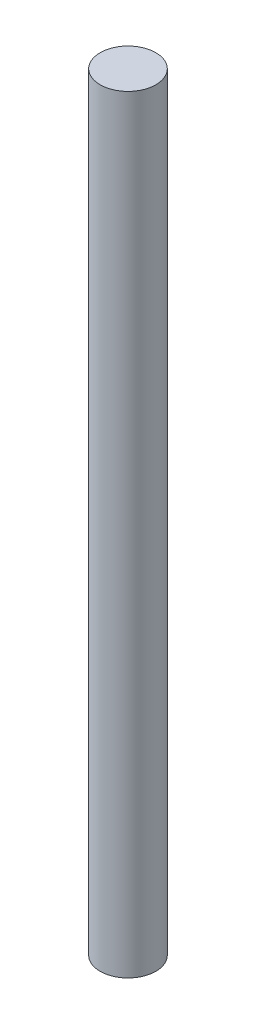
ISO-10303-21;
HEADER;
FILE_DESCRIPTION(('STEP AP214'),'2;1');
FILE_NAME('part.step','',(''),(''),'','','');
FILE_SCHEMA(('AUTOMOTIVE_DESIGN { 1 0 10303 214 1 1 1 1 }'));
ENDSEC;
DATA;
#1=APPLICATION_CONTEXT('core data for automotive mechanical design processes');
#2=APPLICATION_PROTOCOL_DEFINITION('international standard','automotive_design',2000,#1);
#3=PRODUCT_CONTEXT('',#1,'mechanical');
#4=PRODUCT('Part','Part','',(#3));
#5=PRODUCT_RELATED_PRODUCT_CATEGORY('part','',(#4));
#6=PRODUCT_DEFINITION_FORMATION('','',#4);
#7=PRODUCT_DEFINITION_CONTEXT('part definition',#1,'design');
#8=PRODUCT_DEFINITION('design','',#6,#7);
#9=PRODUCT_DEFINITION_SHAPE('','',#8);
#10=(LENGTH_UNIT() NAMED_UNIT(*) SI_UNIT(.MILLI.,.METRE.));
#11=(NAMED_UNIT(*) PLANE_ANGLE_UNIT() SI_UNIT($,.RADIAN.));
#12=(NAMED_UNIT(*) SI_UNIT($,.STERADIAN.) SOLID_ANGLE_UNIT());
#13=UNCERTAINTY_MEASURE_WITH_UNIT(LENGTH_MEASURE(1.E-05),#10,'distance_accuracy_value','');
#14=(GEOMETRIC_REPRESENTATION_CONTEXT(3) GLOBAL_UNCERTAINTY_ASSIGNED_CONTEXT((#13)) GLOBAL_UNIT_ASSIGNED_CONTEXT((#10,
#11,#12)) REPRESENTATION_CONTEXT('',''));
#15=CARTESIAN_POINT('',(0.,0.,0.));
#16=DIRECTION('',(0.,0.,1.));
#17=DIRECTION('',(1.,0.,0.));
#18=AXIS2_PLACEMENT_3D('',#15,#16,#17);
#19=CARTESIAN_POINT('',(0.,138.,0.));
#20=DIRECTION('',(0.,-1.,0.));
#21=DIRECTION('',(0.,0.,-1.));
#22=AXIS2_PLACEMENT_3D('',#19,#20,#21);
#23=CYLINDRICAL_SURFACE('',#22,5.);
#24=CARTESIAN_POINT('',(0.,138.,0.));
#25=DIRECTION('',(0.,1.,0.));
#26=DIRECTION('',(0.,0.,1.));
#27=AXIS2_PLACEMENT_3D('',#24,#25,#26);
#28=CIRCLE('',#27,5.);
#29=CARTESIAN_POINT('',(0.,138.,5.));
#30=VERTEX_POINT('',#29);
#31=EDGE_CURVE('E10',#30,#30,#28,.T.);
#32=ORIENTED_EDGE('',*,*,#31,.F.);
#33=EDGE_LOOP('',(#32));
#34=FACE_BOUND('',#33,.T.);
#35=CARTESIAN_POINT('',(0.,0.,0.));
#36=DIRECTION('',(0.,1.,0.));
#37=DIRECTION('',(0.,0.,1.));
#38=AXIS2_PLACEMENT_3D('',#35,#36,#37);
#39=CIRCLE('',#38,5.);
#40=CARTESIAN_POINT('',(0.,0.,5.));
#41=VERTEX_POINT('',#40);
#42=EDGE_CURVE('E38',#41,#41,#39,.T.);
#43=ORIENTED_EDGE('',*,*,#42,.T.);
#44=EDGE_LOOP('',(#43));
#45=FACE_BOUND('',#44,.T.);
#46=ADVANCED_FACE('F35',(#34,#45),#23,.T.);
#47=CARTESIAN_POINT('',(0.,138.,0.));
#48=DIRECTION('',(0.,1.,0.));
#49=DIRECTION('',(0.,0.,1.));
#50=AXIS2_PLACEMENT_3D('',#47,#48,#49);
#51=PLANE('',#50);
#52=ORIENTED_EDGE('',*,*,#31,.T.);
#53=EDGE_LOOP('',(#52));
#54=FACE_BOUND('',#53,.T.);
#55=ADVANCED_FACE('F50',(#54),#51,.T.);
#56=CARTESIAN_POINT('',(0.,0.,0.));
#57=DIRECTION('',(0.,1.,0.));
#58=DIRECTION('',(0.,0.,1.));
#59=AXIS2_PLACEMENT_3D('',#56,#57,#58);
#60=PLANE('',#59);
#61=ORIENTED_EDGE('',*,*,#42,.F.);
#62=EDGE_LOOP('',(#61));
#63=FACE_BOUND('',#62,.T.);
#64=ADVANCED_FACE('F48',(#63),#60,.F.);
#65=CLOSED_SHELL('',(#46,#55,#64));
#66=MANIFOLD_SOLID_BREP('B2',#65);
#67=ADVANCED_BREP_SHAPE_REPRESENTATION('',(#18,#66),#14);
#68=SHAPE_DEFINITION_REPRESENTATION(#9,#67);
ENDSEC;
END-ISO-10303-21;
